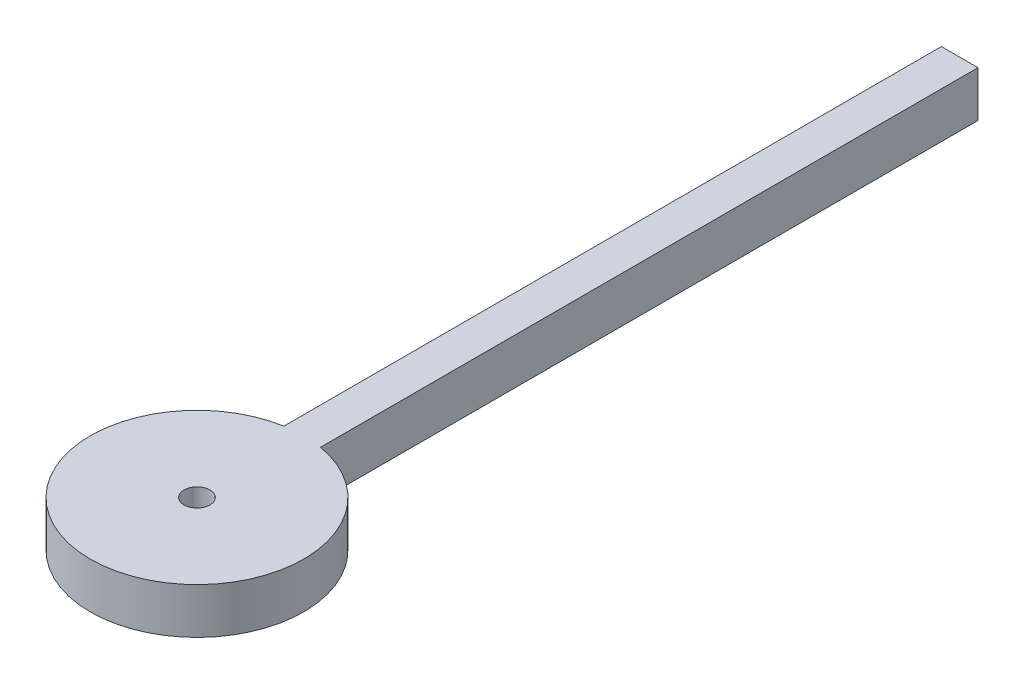
ISO-10303-21;
HEADER;
FILE_DESCRIPTION(('STEP AP214'),'2;1');
FILE_NAME('part.step','',(''),(''),'','','');
FILE_SCHEMA(('AUTOMOTIVE_DESIGN { 1 0 10303 214 1 1 1 1 }'));
ENDSEC;
DATA;
#1=APPLICATION_CONTEXT('core data for automotive mechanical design processes');
#2=APPLICATION_PROTOCOL_DEFINITION('international standard','automotive_design',2000,#1);
#3=PRODUCT_CONTEXT('',#1,'mechanical');
#4=PRODUCT('Part','Part','',(#3));
#5=PRODUCT_RELATED_PRODUCT_CATEGORY('part','',(#4));
#6=PRODUCT_DEFINITION_FORMATION('','',#4);
#7=PRODUCT_DEFINITION_CONTEXT('part definition',#1,'design');
#8=PRODUCT_DEFINITION('design','',#6,#7);
#9=PRODUCT_DEFINITION_SHAPE('','',#8);
#10=(LENGTH_UNIT() NAMED_UNIT(*) SI_UNIT(.MILLI.,.METRE.));
#11=(NAMED_UNIT(*) PLANE_ANGLE_UNIT() SI_UNIT($,.RADIAN.));
#12=(NAMED_UNIT(*) SI_UNIT($,.STERADIAN.) SOLID_ANGLE_UNIT());
#13=UNCERTAINTY_MEASURE_WITH_UNIT(LENGTH_MEASURE(1.E-05),#10,'distance_accuracy_value','');
#14=(GEOMETRIC_REPRESENTATION_CONTEXT(3) GLOBAL_UNCERTAINTY_ASSIGNED_CONTEXT((#13)) GLOBAL_UNIT_ASSIGNED_CONTEXT((#10,
#11,#12)) REPRESENTATION_CONTEXT('',''));
#15=CARTESIAN_POINT('',(0.,0.,0.));
#16=DIRECTION('',(0.,0.,1.));
#17=DIRECTION('',(1.,0.,0.));
#18=AXIS2_PLACEMENT_3D('',#15,#16,#17);
#19=CARTESIAN_POINT('',(0.,0.3,0.));
#20=DIRECTION('',(0.,-1.,0.));
#21=DIRECTION('',(0.,0.,-1.));
#22=AXIS2_PLACEMENT_3D('',#19,#20,#21);
#23=CYLINDRICAL_SURFACE('',#22,0.7);
#24=CARTESIAN_POINT('',(0.,0.,0.));
#25=DIRECTION('',(0.,1.,0.));
#26=DIRECTION('',(0.,0.,-1.));
#27=AXIS2_PLACEMENT_3D('',#24,#25,#26);
#28=CIRCLE('',#27,0.7);
#29=CARTESIAN_POINT('',(-0.12,0.,-0.689637585982667));
#30=VERTEX_POINT('',#29);
#31=CARTESIAN_POINT('',(0.12,0.,-0.689637585982667));
#32=VERTEX_POINT('',#31);
#33=EDGE_CURVE('E96',#30,#32,#28,.T.);
#34=ORIENTED_EDGE('',*,*,#33,.T.);
#35=DIRECTION('',(0.,-1.,0.));
#36=VECTOR('',#35,1.);
#37=CARTESIAN_POINT('',(0.12,0.3,-0.689637585982667));
#38=LINE('',#37,#36);
#39=CARTESIAN_POINT('',(0.12,0.3,-0.689637585982667));
#40=VERTEX_POINT('',#39);
#41=EDGE_CURVE('E11',#40,#32,#38,.T.);
#42=ORIENTED_EDGE('',*,*,#41,.F.);
#43=CARTESIAN_POINT('',(0.,0.3,0.));
#44=DIRECTION('',(0.,1.,0.));
#45=DIRECTION('',(0.,0.,-1.));
#46=AXIS2_PLACEMENT_3D('',#43,#44,#45);
#47=CIRCLE('',#46,0.7);
#48=CARTESIAN_POINT('',(-0.12,0.3,-0.689637585982667));
#49=VERTEX_POINT('',#48);
#50=EDGE_CURVE('E84',#49,#40,#47,.T.);
#51=ORIENTED_EDGE('',*,*,#50,.F.);
#52=DIRECTION('',(0.,-1.,0.));
#53=VECTOR('',#52,1.);
#54=CARTESIAN_POINT('',(-0.12,0.3,-0.689637585982667));
#55=LINE('',#54,#53);
#56=EDGE_CURVE('E92',#49,#30,#55,.T.);
#57=ORIENTED_EDGE('',*,*,#56,.T.);
#58=EDGE_LOOP('',(#34,#42,#51,#57));
#59=FACE_BOUND('',#58,.T.);
#60=ADVANCED_FACE('F33',(#59),#23,.T.);
#61=CARTESIAN_POINT('',(0.12,0.3,-0.689637585982667));
#62=DIRECTION('',(-1.,0.,0.));
#63=DIRECTION('',(0.,0.,1.));
#64=AXIS2_PLACEMENT_3D('',#61,#62,#63);
#65=PLANE('',#64);
#66=DIRECTION('',(0.,0.,-1.));
#67=VECTOR('',#66,1.);
#68=CARTESIAN_POINT('',(0.12,0.,-0.689637585982667));
#69=LINE('',#68,#67);
#70=CARTESIAN_POINT('',(0.12,0.,-5.));
#71=VERTEX_POINT('',#70);
#72=EDGE_CURVE('E88',#32,#71,#69,.T.);
#73=ORIENTED_EDGE('',*,*,#72,.T.);
#74=DIRECTION('',(0.,-1.,0.));
#75=VECTOR('',#74,1.);
#76=CARTESIAN_POINT('',(0.12,0.3,-5.));
#77=LINE('',#76,#75);
#78=CARTESIAN_POINT('',(0.12,0.3,-5.));
#79=VERTEX_POINT('',#78);
#80=EDGE_CURVE('E41',#79,#71,#77,.T.);
#81=ORIENTED_EDGE('',*,*,#80,.F.);
#82=DIRECTION('',(0.,0.,-1.));
#83=VECTOR('',#82,1.);
#84=CARTESIAN_POINT('',(0.12,0.3,-0.689637585982667));
#85=LINE('',#84,#83);
#86=EDGE_CURVE('E79',#40,#79,#85,.T.);
#87=ORIENTED_EDGE('',*,*,#86,.F.);
#88=ORIENTED_EDGE('',*,*,#41,.T.);
#89=EDGE_LOOP('',(#73,#81,#87,#88));
#90=FACE_BOUND('',#89,.T.);
#91=ADVANCED_FACE('F87',(#90),#65,.F.);
#92=CARTESIAN_POINT('',(-0.12,0.3,-5.));
#93=DIRECTION('',(0.,0.,1.));
#94=DIRECTION('',(1.,0.,0.));
#95=AXIS2_PLACEMENT_3D('',#92,#93,#94);
#96=PLANE('',#95);
#97=DIRECTION('',(-1.,0.,0.));
#98=VECTOR('',#97,1.);
#99=CARTESIAN_POINT('',(-0.12,0.,-5.));
#100=LINE('',#99,#98);
#101=CARTESIAN_POINT('',(-0.12,0.,-5.));
#102=VERTEX_POINT('',#101);
#103=EDGE_CURVE('E66',#71,#102,#100,.T.);
#104=ORIENTED_EDGE('',*,*,#103,.T.);
#105=DIRECTION('',(0.,-1.,0.));
#106=VECTOR('',#105,1.);
#107=CARTESIAN_POINT('',(-0.12,0.3,-5.));
#108=LINE('',#107,#106);
#109=CARTESIAN_POINT('',(-0.12,0.3,-5.));
#110=VERTEX_POINT('',#109);
#111=EDGE_CURVE('E89',#110,#102,#108,.T.);
#112=ORIENTED_EDGE('',*,*,#111,.F.);
#113=DIRECTION('',(-1.,0.,0.));
#114=VECTOR('',#113,1.);
#115=CARTESIAN_POINT('',(-0.12,0.3,-5.));
#116=LINE('',#115,#114);
#117=EDGE_CURVE('E82',#79,#110,#116,.T.);
#118=ORIENTED_EDGE('',*,*,#117,.F.);
#119=ORIENTED_EDGE('',*,*,#80,.T.);
#120=EDGE_LOOP('',(#104,#112,#118,#119));
#121=FACE_BOUND('',#120,.T.);
#122=ADVANCED_FACE('F90',(#121),#96,.F.);
#123=CARTESIAN_POINT('',(-0.12,0.3,-0.689637585982667));
#124=DIRECTION('',(1.,0.,0.));
#125=DIRECTION('',(0.,0.,-1.));
#126=AXIS2_PLACEMENT_3D('',#123,#124,#125);
#127=PLANE('',#126);
#128=DIRECTION('',(0.,0.,1.));
#129=VECTOR('',#128,1.);
#130=CARTESIAN_POINT('',(-0.12,0.,-0.689637585982667));
#131=LINE('',#130,#129);
#132=EDGE_CURVE('E72',#102,#30,#131,.T.);
#133=ORIENTED_EDGE('',*,*,#132,.T.);
#134=ORIENTED_EDGE('',*,*,#56,.F.);
#135=DIRECTION('',(0.,0.,1.));
#136=VECTOR('',#135,1.);
#137=CARTESIAN_POINT('',(-0.12,0.3,-0.689637585982667));
#138=LINE('',#137,#136);
#139=EDGE_CURVE('E49',#110,#49,#138,.T.);
#140=ORIENTED_EDGE('',*,*,#139,.F.);
#141=ORIENTED_EDGE('',*,*,#111,.T.);
#142=EDGE_LOOP('',(#133,#134,#140,#141));
#143=FACE_BOUND('',#142,.T.);
#144=ADVANCED_FACE('F104',(#143),#127,.F.);
#145=CARTESIAN_POINT('',(0.,0.3,0.));
#146=DIRECTION('',(0.,-1.,0.));
#147=DIRECTION('',(0.,0.,-1.));
#148=AXIS2_PLACEMENT_3D('',#145,#146,#147);
#149=PLANE('',#148);
#150=CARTESIAN_POINT('',(0.,0.3,0.));
#151=DIRECTION('',(0.,1.,0.));
#152=DIRECTION('',(0.,0.,1.));
#153=AXIS2_PLACEMENT_3D('',#150,#151,#152);
#154=CIRCLE('',#153,0.085);
#155=CARTESIAN_POINT('',(0.,0.3,0.085));
#156=VERTEX_POINT('',#155);
#157=EDGE_CURVE('E110',#156,#156,#154,.T.);
#158=ORIENTED_EDGE('',*,*,#157,.F.);
#159=EDGE_LOOP('',(#158));
#160=FACE_BOUND('',#159,.T.);
#161=ORIENTED_EDGE('',*,*,#50,.T.);
#162=ORIENTED_EDGE('',*,*,#86,.T.);
#163=ORIENTED_EDGE('',*,*,#117,.T.);
#164=ORIENTED_EDGE('',*,*,#139,.T.);
#165=EDGE_LOOP('',(#161,#162,#163,#164));
#166=FACE_BOUND('',#165,.T.);
#167=ADVANCED_FACE('F80',(#160,#166),#149,.F.);
#168=CARTESIAN_POINT('',(0.,0.,0.));
#169=DIRECTION('',(0.,-1.,0.));
#170=DIRECTION('',(0.,0.,-1.));
#171=AXIS2_PLACEMENT_3D('',#168,#169,#170);
#172=PLANE('',#171);
#173=CARTESIAN_POINT('',(0.,0.,0.));
#174=DIRECTION('',(0.,1.,0.));
#175=DIRECTION('',(0.,0.,1.));
#176=AXIS2_PLACEMENT_3D('',#173,#174,#175);
#177=CIRCLE('',#176,0.085);
#178=CARTESIAN_POINT('',(0.,0.,0.085));
#179=VERTEX_POINT('',#178);
#180=EDGE_CURVE('E99',#179,#179,#177,.T.);
#181=ORIENTED_EDGE('',*,*,#180,.T.);
#182=EDGE_LOOP('',(#181));
#183=FACE_BOUND('',#182,.T.);
#184=ORIENTED_EDGE('',*,*,#33,.F.);
#185=ORIENTED_EDGE('',*,*,#132,.F.);
#186=ORIENTED_EDGE('',*,*,#103,.F.);
#187=ORIENTED_EDGE('',*,*,#72,.F.);
#188=EDGE_LOOP('',(#184,#185,#186,#187));
#189=FACE_BOUND('',#188,.T.);
#190=ADVANCED_FACE('F107',(#183,#189),#172,.T.);
#191=CARTESIAN_POINT('',(0.,0.,0.));
#192=DIRECTION('',(0.,1.,0.));
#193=DIRECTION('',(0.,0.,1.));
#194=AXIS2_PLACEMENT_3D('',#191,#192,#193);
#195=CYLINDRICAL_SURFACE('',#194,0.085);
#196=ORIENTED_EDGE('',*,*,#180,.F.);
#197=EDGE_LOOP('',(#196));
#198=FACE_BOUND('',#197,.T.);
#199=ORIENTED_EDGE('',*,*,#157,.T.);
#200=EDGE_LOOP('',(#199));
#201=FACE_BOUND('',#200,.T.);
#202=ADVANCED_FACE('F117',(#198,#201),#195,.F.);
#203=CLOSED_SHELL('',(#60,#91,#122,#144,#167,#190,#202));
#204=MANIFOLD_SOLID_BREP('B2',#203);
#205=ADVANCED_BREP_SHAPE_REPRESENTATION('',(#18,#204),#14);
#206=SHAPE_DEFINITION_REPRESENTATION(#9,#205);
ENDSEC;
END-ISO-10303-21;
